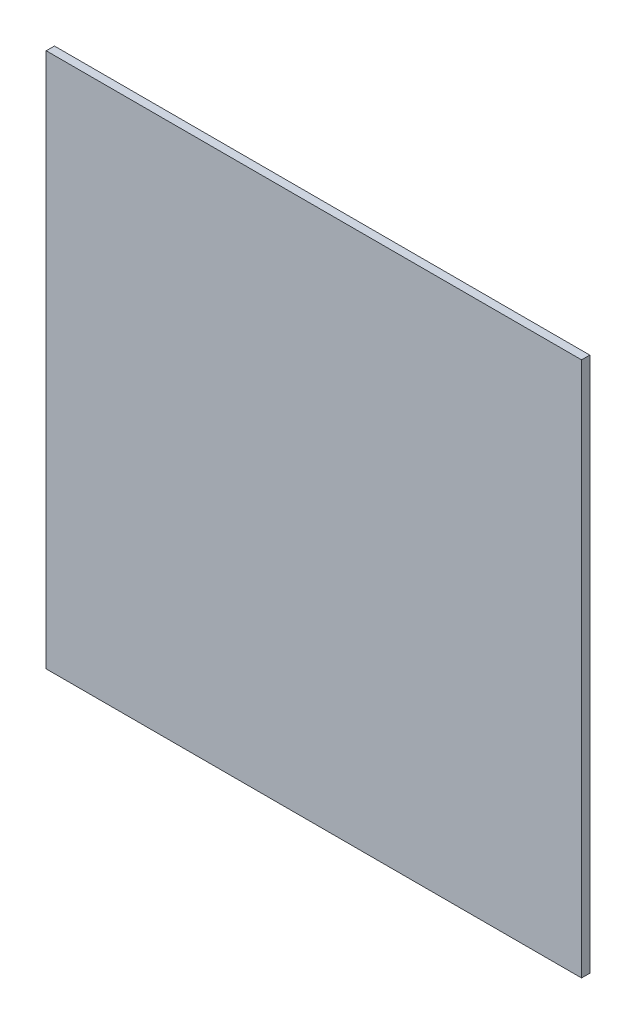
ISO-10303-21;
HEADER;
FILE_DESCRIPTION(('STEP AP214'),'2;1');
FILE_NAME('part.step','',(''),(''),'','','');
FILE_SCHEMA(('AUTOMOTIVE_DESIGN { 1 0 10303 214 1 1 1 1 }'));
ENDSEC;
DATA;
#1=APPLICATION_CONTEXT('core data for automotive mechanical design processes');
#2=APPLICATION_PROTOCOL_DEFINITION('international standard','automotive_design',2000,#1);
#3=PRODUCT_CONTEXT('',#1,'mechanical');
#4=PRODUCT('Part','Part','',(#3));
#5=PRODUCT_RELATED_PRODUCT_CATEGORY('part','',(#4));
#6=PRODUCT_DEFINITION_FORMATION('','',#4);
#7=PRODUCT_DEFINITION_CONTEXT('part definition',#1,'design');
#8=PRODUCT_DEFINITION('design','',#6,#7);
#9=PRODUCT_DEFINITION_SHAPE('','',#8);
#10=(LENGTH_UNIT() NAMED_UNIT(*) SI_UNIT(.MILLI.,.METRE.));
#11=(NAMED_UNIT(*) PLANE_ANGLE_UNIT() SI_UNIT($,.RADIAN.));
#12=(NAMED_UNIT(*) SI_UNIT($,.STERADIAN.) SOLID_ANGLE_UNIT());
#13=UNCERTAINTY_MEASURE_WITH_UNIT(LENGTH_MEASURE(1.E-05),#10,'distance_accuracy_value','');
#14=(GEOMETRIC_REPRESENTATION_CONTEXT(3) GLOBAL_UNCERTAINTY_ASSIGNED_CONTEXT((#13)) GLOBAL_UNIT_ASSIGNED_CONTEXT((#10,
#11,#12)) REPRESENTATION_CONTEXT('',''));
#15=CARTESIAN_POINT('',(0.,0.,0.));
#16=DIRECTION('',(0.,0.,1.));
#17=DIRECTION('',(1.,0.,0.));
#18=AXIS2_PLACEMENT_3D('',#15,#16,#17);
#19=CARTESIAN_POINT('',(-13.1174698795181,13.6558734939759,0.5));
#20=DIRECTION('',(1.,0.,0.));
#21=DIRECTION('',(0.,1.,0.));
#22=AXIS2_PLACEMENT_3D('',#19,#20,#21);
#23=PLANE('',#22);
#24=DIRECTION('',(0.,-1.,0.));
#25=VECTOR('',#24,1.);
#26=CARTESIAN_POINT('',(-13.1174698795181,13.6558734939759,0.));
#27=LINE('',#26,#25);
#28=CARTESIAN_POINT('',(-13.1174698795181,13.6558734939759,0.));
#29=VERTEX_POINT('',#28);
#30=CARTESIAN_POINT('',(-13.1174698795181,-18.8441265060241,0.));
#31=VERTEX_POINT('',#30);
#32=EDGE_CURVE('E113',#29,#31,#27,.T.);
#33=ORIENTED_EDGE('',*,*,#32,.T.);
#34=DIRECTION('',(0.,0.,-1.));
#35=VECTOR('',#34,1.);
#36=CARTESIAN_POINT('',(-13.1174698795181,-18.8441265060241,0.5));
#37=LINE('',#36,#35);
#38=CARTESIAN_POINT('',(-13.1174698795181,-18.8441265060241,0.5));
#39=VERTEX_POINT('',#38);
#40=EDGE_CURVE('E11',#39,#31,#37,.T.);
#41=ORIENTED_EDGE('',*,*,#40,.F.);
#42=DIRECTION('',(0.,-1.,0.));
#43=VECTOR('',#42,1.);
#44=CARTESIAN_POINT('',(-13.1174698795181,13.6558734939759,0.5));
#45=LINE('',#44,#43);
#46=CARTESIAN_POINT('',(-13.1174698795181,13.6558734939759,0.5));
#47=VERTEX_POINT('',#46);
#48=EDGE_CURVE('E97',#47,#39,#45,.T.);
#49=ORIENTED_EDGE('',*,*,#48,.F.);
#50=DIRECTION('',(0.,0.,-1.));
#51=VECTOR('',#50,1.);
#52=CARTESIAN_POINT('',(-13.1174698795181,13.6558734939759,0.5));
#53=LINE('',#52,#51);
#54=EDGE_CURVE('E109',#47,#29,#53,.T.);
#55=ORIENTED_EDGE('',*,*,#54,.T.);
#56=EDGE_LOOP('',(#33,#41,#49,#55));
#57=FACE_BOUND('',#56,.T.);
#58=ADVANCED_FACE('F45',(#57),#23,.F.);
#59=CARTESIAN_POINT('',(-13.1174698795181,-18.8441265060241,0.5));
#60=DIRECTION('',(0.,1.,0.));
#61=DIRECTION('',(0.,0.,1.));
#62=AXIS2_PLACEMENT_3D('',#59,#60,#61);
#63=PLANE('',#62);
#64=DIRECTION('',(1.,0.,0.));
#65=VECTOR('',#64,1.);
#66=CARTESIAN_POINT('',(-13.1174698795181,-18.8441265060241,0.));
#67=LINE('',#66,#65);
#68=CARTESIAN_POINT('',(19.3825301204819,-18.8441265060241,0.));
#69=VERTEX_POINT('',#68);
#70=EDGE_CURVE('E102',#31,#69,#67,.T.);
#71=ORIENTED_EDGE('',*,*,#70,.T.);
#72=DIRECTION('',(0.,0.,-1.));
#73=VECTOR('',#72,1.);
#74=CARTESIAN_POINT('',(19.3825301204819,-18.8441265060241,0.5));
#75=LINE('',#74,#73);
#76=CARTESIAN_POINT('',(19.3825301204819,-18.8441265060241,0.5));
#77=VERTEX_POINT('',#76);
#78=EDGE_CURVE('E54',#77,#69,#75,.T.);
#79=ORIENTED_EDGE('',*,*,#78,.F.);
#80=DIRECTION('',(1.,0.,0.));
#81=VECTOR('',#80,1.);
#82=CARTESIAN_POINT('',(-13.1174698795181,-18.8441265060241,0.5));
#83=LINE('',#82,#81);
#84=EDGE_CURVE('E92',#39,#77,#83,.T.);
#85=ORIENTED_EDGE('',*,*,#84,.F.);
#86=ORIENTED_EDGE('',*,*,#40,.T.);
#87=EDGE_LOOP('',(#71,#79,#85,#86));
#88=FACE_BOUND('',#87,.T.);
#89=ADVANCED_FACE('F101',(#88),#63,.F.);
#90=CARTESIAN_POINT('',(19.3825301204819,13.6558734939759,0.5));
#91=DIRECTION('',(-1.,0.,0.));
#92=DIRECTION('',(0.,-1.,0.));
#93=AXIS2_PLACEMENT_3D('',#90,#91,#92);
#94=PLANE('',#93);
#95=DIRECTION('',(0.,1.,0.));
#96=VECTOR('',#95,1.);
#97=CARTESIAN_POINT('',(19.3825301204819,13.6558734939759,0.));
#98=LINE('',#97,#96);
#99=CARTESIAN_POINT('',(19.3825301204819,13.6558734939759,0.));
#100=VERTEX_POINT('',#99);
#101=EDGE_CURVE('E79',#69,#100,#98,.T.);
#102=ORIENTED_EDGE('',*,*,#101,.T.);
#103=DIRECTION('',(0.,0.,-1.));
#104=VECTOR('',#103,1.);
#105=CARTESIAN_POINT('',(19.3825301204819,13.6558734939759,0.5));
#106=LINE('',#105,#104);
#107=CARTESIAN_POINT('',(19.3825301204819,13.6558734939759,0.5));
#108=VERTEX_POINT('',#107);
#109=EDGE_CURVE('E104',#108,#100,#106,.T.);
#110=ORIENTED_EDGE('',*,*,#109,.F.);
#111=DIRECTION('',(0.,1.,0.));
#112=VECTOR('',#111,1.);
#113=CARTESIAN_POINT('',(19.3825301204819,13.6558734939759,0.5));
#114=LINE('',#113,#112);
#115=EDGE_CURVE('E95',#77,#108,#114,.T.);
#116=ORIENTED_EDGE('',*,*,#115,.F.);
#117=ORIENTED_EDGE('',*,*,#78,.T.);
#118=EDGE_LOOP('',(#102,#110,#116,#117));
#119=FACE_BOUND('',#118,.T.);
#120=ADVANCED_FACE('F105',(#119),#94,.F.);
#121=CARTESIAN_POINT('',(-13.1174698795181,13.6558734939759,0.5));
#122=DIRECTION('',(0.,-1.,0.));
#123=DIRECTION('',(0.,0.,-1.));
#124=AXIS2_PLACEMENT_3D('',#121,#122,#123);
#125=PLANE('',#124);
#126=DIRECTION('',(-1.,0.,0.));
#127=VECTOR('',#126,1.);
#128=CARTESIAN_POINT('',(-13.1174698795181,13.6558734939759,0.));
#129=LINE('',#128,#127);
#130=EDGE_CURVE('E85',#100,#29,#129,.T.);
#131=ORIENTED_EDGE('',*,*,#130,.T.);
#132=ORIENTED_EDGE('',*,*,#54,.F.);
#133=DIRECTION('',(-1.,0.,0.));
#134=VECTOR('',#133,1.);
#135=CARTESIAN_POINT('',(-13.1174698795181,13.6558734939759,0.5));
#136=LINE('',#135,#134);
#137=EDGE_CURVE('E62',#108,#47,#136,.T.);
#138=ORIENTED_EDGE('',*,*,#137,.F.);
#139=ORIENTED_EDGE('',*,*,#109,.T.);
#140=EDGE_LOOP('',(#131,#132,#138,#139));
#141=FACE_BOUND('',#140,.T.);
#142=ADVANCED_FACE('F126',(#141),#125,.F.);
#143=CARTESIAN_POINT('',(0.,0.,0.5));
#144=DIRECTION('',(0.,0.,1.));
#145=DIRECTION('',(1.,0.,0.));
#146=AXIS2_PLACEMENT_3D('',#143,#144,#145);
#147=PLANE('',#146);
#148=ORIENTED_EDGE('',*,*,#48,.T.);
#149=ORIENTED_EDGE('',*,*,#84,.T.);
#150=ORIENTED_EDGE('',*,*,#115,.T.);
#151=ORIENTED_EDGE('',*,*,#137,.T.);
#152=EDGE_LOOP('',(#148,#149,#150,#151));
#153=FACE_BOUND('',#152,.T.);
#154=ADVANCED_FACE('F93',(#153),#147,.T.);
#155=CARTESIAN_POINT('',(0.,0.,0.));
#156=DIRECTION('',(0.,0.,1.));
#157=DIRECTION('',(1.,0.,0.));
#158=AXIS2_PLACEMENT_3D('',#155,#156,#157);
#159=PLANE('',#158);
#160=ORIENTED_EDGE('',*,*,#32,.F.);
#161=ORIENTED_EDGE('',*,*,#130,.F.);
#162=ORIENTED_EDGE('',*,*,#101,.F.);
#163=ORIENTED_EDGE('',*,*,#70,.F.);
#164=EDGE_LOOP('',(#160,#161,#162,#163));
#165=FACE_BOUND('',#164,.T.);
#166=ADVANCED_FACE('F129',(#165),#159,.F.);
#167=CLOSED_SHELL('',(#58,#89,#120,#142,#154,#166));
#168=MANIFOLD_SOLID_BREP('B2',#167);
#169=ADVANCED_BREP_SHAPE_REPRESENTATION('',(#18,#168),#14);
#170=SHAPE_DEFINITION_REPRESENTATION(#9,#169);
ENDSEC;
END-ISO-10303-21;
